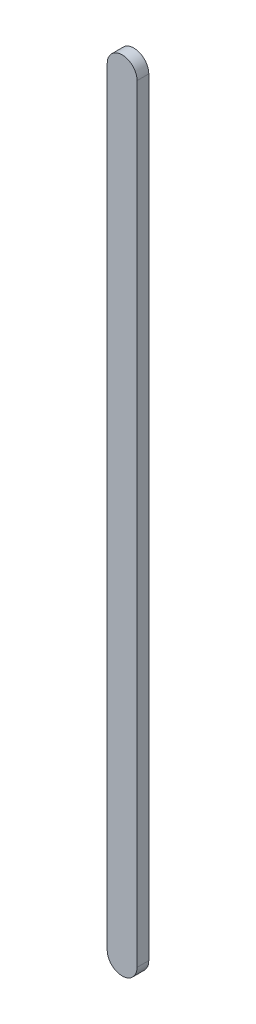
ISO-10303-21;
HEADER;
FILE_DESCRIPTION(('STEP AP214'),'2;1');
FILE_NAME('part.step','',(''),(''),'','','');
FILE_SCHEMA(('AUTOMOTIVE_DESIGN { 1 0 10303 214 1 1 1 1 }'));
ENDSEC;
DATA;
#1=APPLICATION_CONTEXT('core data for automotive mechanical design processes');
#2=APPLICATION_PROTOCOL_DEFINITION('international standard','automotive_design',2000,#1);
#3=PRODUCT_CONTEXT('',#1,'mechanical');
#4=PRODUCT('Part','Part','',(#3));
#5=PRODUCT_RELATED_PRODUCT_CATEGORY('part','',(#4));
#6=PRODUCT_DEFINITION_FORMATION('','',#4);
#7=PRODUCT_DEFINITION_CONTEXT('part definition',#1,'design');
#8=PRODUCT_DEFINITION('design','',#6,#7);
#9=PRODUCT_DEFINITION_SHAPE('','',#8);
#10=(LENGTH_UNIT() NAMED_UNIT(*) SI_UNIT(.MILLI.,.METRE.));
#11=(NAMED_UNIT(*) PLANE_ANGLE_UNIT() SI_UNIT($,.RADIAN.));
#12=(NAMED_UNIT(*) SI_UNIT($,.STERADIAN.) SOLID_ANGLE_UNIT());
#13=UNCERTAINTY_MEASURE_WITH_UNIT(LENGTH_MEASURE(1.E-05),#10,'distance_accuracy_value','');
#14=(GEOMETRIC_REPRESENTATION_CONTEXT(3) GLOBAL_UNCERTAINTY_ASSIGNED_CONTEXT((#13)) GLOBAL_UNIT_ASSIGNED_CONTEXT((#10,
#11,#12)) REPRESENTATION_CONTEXT('',''));
#15=CARTESIAN_POINT('',(0.,0.,0.));
#16=DIRECTION('',(0.,0.,1.));
#17=DIRECTION('',(1.,0.,0.));
#18=AXIS2_PLACEMENT_3D('',#15,#16,#17);
#19=CARTESIAN_POINT('',(151.384,75.692,0.));
#20=DIRECTION('',(-1.,0.,0.));
#21=DIRECTION('',(0.,1.,0.));
#22=AXIS2_PLACEMENT_3D('',#19,#20,#21);
#23=PLANE('',#22);
#24=DIRECTION('',(0.,1.,0.));
#25=VECTOR('',#24,1.);
#26=CARTESIAN_POINT('',(151.384,75.692,0.1999996));
#27=LINE('',#26,#25);
#28=CARTESIAN_POINT('',(151.384,75.692,0.1999996));
#29=VERTEX_POINT('',#28);
#30=CARTESIAN_POINT('',(151.384,88.773,0.1999996));
#31=VERTEX_POINT('',#30);
#32=EDGE_CURVE('E11',#29,#31,#27,.T.);
#33=ORIENTED_EDGE('',*,*,#32,.F.);
#34=DIRECTION('',(0.,0.,1.));
#35=VECTOR('',#34,1.);
#36=CARTESIAN_POINT('',(151.384,75.692,0.));
#37=LINE('',#36,#35);
#38=CARTESIAN_POINT('',(151.384,75.692,0.));
#39=VERTEX_POINT('',#38);
#40=EDGE_CURVE('E24',#39,#29,#37,.T.);
#41=ORIENTED_EDGE('',*,*,#40,.F.);
#42=DIRECTION('',(0.,1.,0.));
#43=VECTOR('',#42,1.);
#44=CARTESIAN_POINT('',(151.384,75.692,0.));
#45=LINE('',#44,#43);
#46=CARTESIAN_POINT('',(151.384,88.773,0.));
#47=VERTEX_POINT('',#46);
#48=EDGE_CURVE('E75',#39,#47,#45,.T.);
#49=ORIENTED_EDGE('',*,*,#48,.T.);
#50=DIRECTION('',(0.,0.,1.));
#51=VECTOR('',#50,1.);
#52=CARTESIAN_POINT('',(151.384,88.773,0.));
#53=LINE('',#52,#51);
#54=EDGE_CURVE('E37',#47,#31,#53,.T.);
#55=ORIENTED_EDGE('',*,*,#54,.T.);
#56=EDGE_LOOP('',(#33,#41,#49,#55));
#57=FACE_BOUND('',#56,.T.);
#58=ADVANCED_FACE('F17',(#57),#23,.F.);
#59=CARTESIAN_POINT('',(151.13,88.773,0.));
#60=DIRECTION('',(0.,0.,-1.));
#61=DIRECTION('',(1.,0.,0.));
#62=AXIS2_PLACEMENT_3D('',#59,#60,#61);
#63=CYLINDRICAL_SURFACE('',#62,0.253999999999995);
#64=CARTESIAN_POINT('',(151.13,88.773,0.1999996));
#65=DIRECTION('',(0.,0.,1.));
#66=DIRECTION('',(1.,0.,0.));
#67=AXIS2_PLACEMENT_3D('',#64,#65,#66);
#68=CIRCLE('',#67,0.253999999999995);
#69=CARTESIAN_POINT('',(150.876,88.773,0.1999996));
#70=VERTEX_POINT('',#69);
#71=EDGE_CURVE('E83',#31,#70,#68,.T.);
#72=ORIENTED_EDGE('',*,*,#71,.F.);
#73=ORIENTED_EDGE('',*,*,#54,.F.);
#74=CARTESIAN_POINT('',(151.13,88.773,0.));
#75=DIRECTION('',(0.,0.,1.));
#76=DIRECTION('',(1.,0.,0.));
#77=AXIS2_PLACEMENT_3D('',#74,#75,#76);
#78=CIRCLE('',#77,0.253999999999995);
#79=CARTESIAN_POINT('',(150.876,88.773,0.));
#80=VERTEX_POINT('',#79);
#81=EDGE_CURVE('E81',#47,#80,#78,.T.);
#82=ORIENTED_EDGE('',*,*,#81,.T.);
#83=DIRECTION('',(0.,0.,1.));
#84=VECTOR('',#83,1.);
#85=CARTESIAN_POINT('',(150.876,88.773,0.));
#86=LINE('',#85,#84);
#87=EDGE_CURVE('E67',#80,#70,#86,.T.);
#88=ORIENTED_EDGE('',*,*,#87,.T.);
#89=EDGE_LOOP('',(#72,#73,#82,#88));
#90=FACE_BOUND('',#89,.T.);
#91=ADVANCED_FACE('F89',(#90),#63,.T.);
#92=CARTESIAN_POINT('',(150.876,88.773,0.));
#93=DIRECTION('',(1.,0.,0.));
#94=DIRECTION('',(0.,-1.,0.));
#95=AXIS2_PLACEMENT_3D('',#92,#93,#94);
#96=PLANE('',#95);
#97=DIRECTION('',(0.,-1.,0.));
#98=VECTOR('',#97,1.);
#99=CARTESIAN_POINT('',(150.876,88.773,0.1999996));
#100=LINE('',#99,#98);
#101=CARTESIAN_POINT('',(150.876,75.692,0.1999996));
#102=VERTEX_POINT('',#101);
#103=EDGE_CURVE('E71',#70,#102,#100,.T.);
#104=ORIENTED_EDGE('',*,*,#103,.F.);
#105=ORIENTED_EDGE('',*,*,#87,.F.);
#106=DIRECTION('',(0.,-1.,0.));
#107=VECTOR('',#106,1.);
#108=CARTESIAN_POINT('',(150.876,88.773,0.));
#109=LINE('',#108,#107);
#110=CARTESIAN_POINT('',(150.876,75.692,0.));
#111=VERTEX_POINT('',#110);
#112=EDGE_CURVE('E63',#80,#111,#109,.T.);
#113=ORIENTED_EDGE('',*,*,#112,.T.);
#114=DIRECTION('',(0.,0.,1.));
#115=VECTOR('',#114,1.);
#116=CARTESIAN_POINT('',(150.876,75.692,0.));
#117=LINE('',#116,#115);
#118=EDGE_CURVE('E53',#111,#102,#117,.T.);
#119=ORIENTED_EDGE('',*,*,#118,.T.);
#120=EDGE_LOOP('',(#104,#105,#113,#119));
#121=FACE_BOUND('',#120,.T.);
#122=ADVANCED_FACE('F66',(#121),#96,.F.);
#123=CARTESIAN_POINT('',(151.13,75.692,0.));
#124=DIRECTION('',(0.,0.,-1.));
#125=DIRECTION('',(-1.,0.,0.));
#126=AXIS2_PLACEMENT_3D('',#123,#124,#125);
#127=CYLINDRICAL_SURFACE('',#126,0.253999999999995);
#128=CARTESIAN_POINT('',(151.13,75.692,0.1999996));
#129=DIRECTION('',(0.,0.,1.));
#130=DIRECTION('',(-1.,0.,0.));
#131=AXIS2_PLACEMENT_3D('',#128,#129,#130);
#132=CIRCLE('',#131,0.253999999999995);
#133=EDGE_CURVE('E59',#102,#29,#132,.T.);
#134=ORIENTED_EDGE('',*,*,#133,.F.);
#135=ORIENTED_EDGE('',*,*,#118,.F.);
#136=CARTESIAN_POINT('',(151.13,75.692,0.));
#137=DIRECTION('',(0.,0.,1.));
#138=DIRECTION('',(-1.,0.,0.));
#139=AXIS2_PLACEMENT_3D('',#136,#137,#138);
#140=CIRCLE('',#139,0.253999999999995);
#141=EDGE_CURVE('E57',#111,#39,#140,.T.);
#142=ORIENTED_EDGE('',*,*,#141,.T.);
#143=ORIENTED_EDGE('',*,*,#40,.T.);
#144=EDGE_LOOP('',(#134,#135,#142,#143));
#145=FACE_BOUND('',#144,.T.);
#146=ADVANCED_FACE('F55',(#145),#127,.T.);
#147=CARTESIAN_POINT('',(151.384,75.692,0.));
#148=DIRECTION('',(0.,0.,-1.));
#149=DIRECTION('',(-1.,0.,0.));
#150=AXIS2_PLACEMENT_3D('',#147,#148,#149);
#151=PLANE('',#150);
#152=ORIENTED_EDGE('',*,*,#141,.F.);
#153=ORIENTED_EDGE('',*,*,#112,.F.);
#154=ORIENTED_EDGE('',*,*,#81,.F.);
#155=ORIENTED_EDGE('',*,*,#48,.F.);
#156=EDGE_LOOP('',(#152,#153,#154,#155));
#157=FACE_BOUND('',#156,.T.);
#158=ADVANCED_FACE('F74',(#157),#151,.T.);
#159=CARTESIAN_POINT('',(151.384,75.692,0.1999996));
#160=DIRECTION('',(0.,0.,-1.));
#161=DIRECTION('',(-1.,0.,0.));
#162=AXIS2_PLACEMENT_3D('',#159,#160,#161);
#163=PLANE('',#162);
#164=ORIENTED_EDGE('',*,*,#32,.T.);
#165=ORIENTED_EDGE('',*,*,#71,.T.);
#166=ORIENTED_EDGE('',*,*,#103,.T.);
#167=ORIENTED_EDGE('',*,*,#133,.T.);
#168=EDGE_LOOP('',(#164,#165,#166,#167));
#169=FACE_BOUND('',#168,.T.);
#170=ADVANCED_FACE('F91',(#169),#163,.F.);
#171=CLOSED_SHELL('',(#58,#91,#122,#146,#158,#170));
#172=MANIFOLD_SOLID_BREP('B1',#171);
#173=ADVANCED_BREP_SHAPE_REPRESENTATION('',(#18,#172),#14);
#174=SHAPE_DEFINITION_REPRESENTATION(#9,#173);
ENDSEC;
END-ISO-10303-21;
